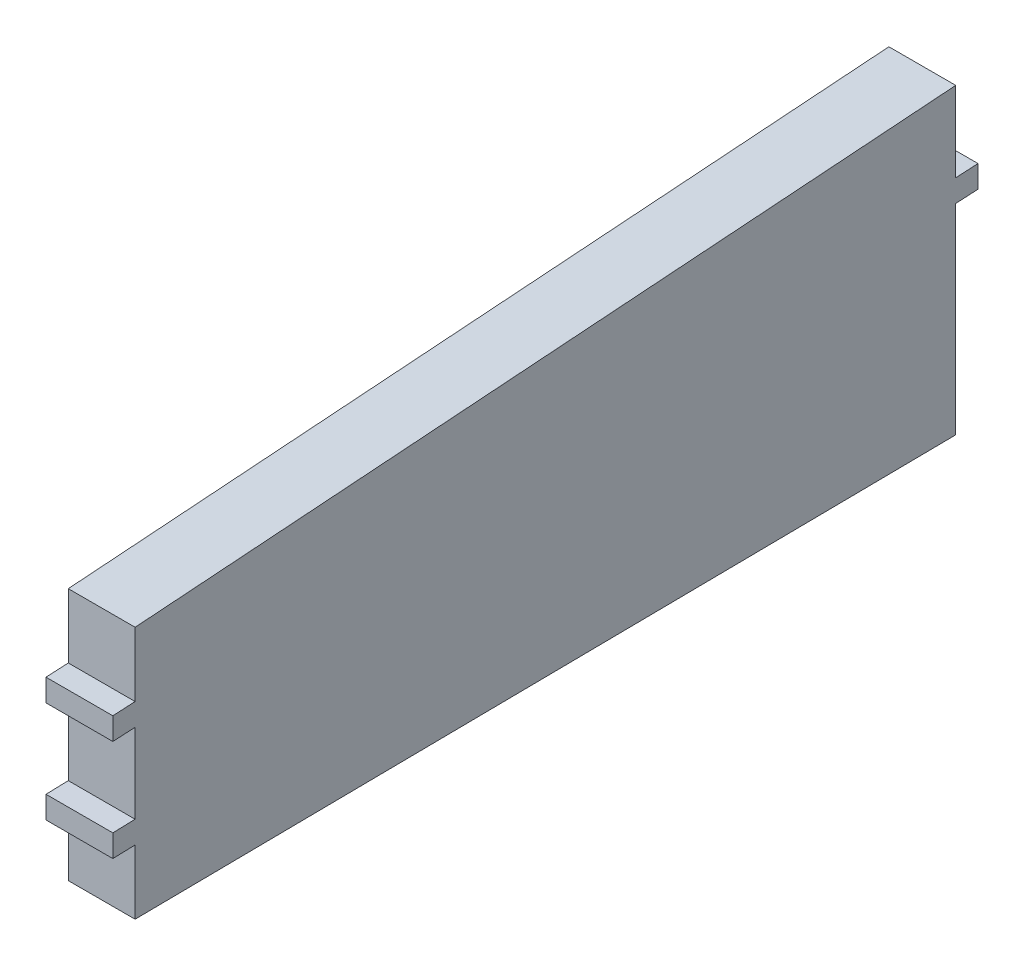
ISO-10303-21;
HEADER;
FILE_DESCRIPTION(('STEP AP214'),'2;1');
FILE_NAME('part.step','',(''),(''),'','','');
FILE_SCHEMA(('AUTOMOTIVE_DESIGN { 1 0 10303 214 1 1 1 1 }'));
ENDSEC;
DATA;
#1=APPLICATION_CONTEXT('core data for automotive mechanical design processes');
#2=APPLICATION_PROTOCOL_DEFINITION('international standard','automotive_design',2000,#1);
#3=PRODUCT_CONTEXT('',#1,'mechanical');
#4=PRODUCT('Part','Part','',(#3));
#5=PRODUCT_RELATED_PRODUCT_CATEGORY('part','',(#4));
#6=PRODUCT_DEFINITION_FORMATION('','',#4);
#7=PRODUCT_DEFINITION_CONTEXT('part definition',#1,'design');
#8=PRODUCT_DEFINITION('design','',#6,#7);
#9=PRODUCT_DEFINITION_SHAPE('','',#8);
#10=(LENGTH_UNIT() NAMED_UNIT(*) SI_UNIT(.MILLI.,.METRE.));
#11=(NAMED_UNIT(*) PLANE_ANGLE_UNIT() SI_UNIT($,.RADIAN.));
#12=(NAMED_UNIT(*) SI_UNIT($,.STERADIAN.) SOLID_ANGLE_UNIT());
#13=UNCERTAINTY_MEASURE_WITH_UNIT(LENGTH_MEASURE(1.E-05),#10,'distance_accuracy_value','');
#14=(GEOMETRIC_REPRESENTATION_CONTEXT(3) GLOBAL_UNCERTAINTY_ASSIGNED_CONTEXT((#13)) GLOBAL_UNIT_ASSIGNED_CONTEXT((#10,
#11,#12)) REPRESENTATION_CONTEXT('',''));
#15=CARTESIAN_POINT('',(0.,0.,0.));
#16=DIRECTION('',(0.,0.,1.));
#17=DIRECTION('',(1.,0.,0.));
#18=AXIS2_PLACEMENT_3D('',#15,#16,#17);
#19=CARTESIAN_POINT('',(243.017706630704,0.,0.));
#20=DIRECTION('',(1.,0.,0.));
#21=DIRECTION('',(0.,0.,-1.));
#22=AXIS2_PLACEMENT_3D('',#19,#20,#21);
#23=PLANE('',#22);
#24=DIRECTION('',(0.,-0.0302886855911997,0.999541192510423));
#25=VECTOR('',#24,1.);
#26=CARTESIAN_POINT('',(243.017706630704,370.209803979882,1137.24369407791));
#27=LINE('',#26,#25);
#28=CARTESIAN_POINT('',(243.017706630704,370.209803979882,1137.24369407791));
#29=VERTEX_POINT('',#28);
#30=CARTESIAN_POINT('',(243.017706630704,370.113593260932,1140.41869407791));
#31=VERTEX_POINT('',#30);
#32=EDGE_CURVE('E157',#29,#31,#27,.T.);
#33=ORIENTED_EDGE('',*,*,#32,.F.);
#34=DIRECTION('',(0.,-1.,0.));
#35=VECTOR('',#34,1.);
#36=CARTESIAN_POINT('',(243.017706630704,381.55777098048,1137.24369407791));
#37=LINE('',#36,#35);
#38=CARTESIAN_POINT('',(243.017706630704,381.55777098048,1137.24369407791));
#39=VERTEX_POINT('',#38);
#40=EDGE_CURVE('E205',#39,#29,#37,.T.);
#41=ORIENTED_EDGE('',*,*,#40,.F.);
#42=DIRECTION('',(0.,0.0527109798388475,-0.99860980998808));
#43=VECTOR('',#42,1.);
#44=CARTESIAN_POINT('',(243.017706630704,381.55777098048,1137.24369407791));
#45=LINE('',#44,#43);
#46=CARTESIAN_POINT('',(243.017706630704,381.39018063707,1140.41869407791));
#47=VERTEX_POINT('',#46);
#48=EDGE_CURVE('E202',#47,#39,#45,.T.);
#49=ORIENTED_EDGE('',*,*,#48,.F.);
#50=DIRECTION('',(0.,-1.,0.));
#51=VECTOR('',#50,1.);
#52=CARTESIAN_POINT('',(243.017706630704,384.56518063707,1140.41869407791));
#53=LINE('',#52,#51);
#54=CARTESIAN_POINT('',(243.017706630704,384.56518063707,1140.41869407791));
#55=VERTEX_POINT('',#54);
#56=EDGE_CURVE('E199',#55,#47,#53,.T.);
#57=ORIENTED_EDGE('',*,*,#56,.F.);
#58=DIRECTION('',(0.,-0.0527109798388301,0.998609809988081));
#59=VECTOR('',#58,1.);
#60=CARTESIAN_POINT('',(243.017706630704,384.73277098048,1137.24369407791));
#61=LINE('',#60,#59);
#62=CARTESIAN_POINT('',(243.017706630704,384.73277098048,1137.24369407791));
#63=VERTEX_POINT('',#62);
#64=EDGE_CURVE('E196',#63,#55,#61,.T.);
#65=ORIENTED_EDGE('',*,*,#64,.F.);
#66=DIRECTION('',(0.,-1.,0.));
#67=VECTOR('',#66,1.);
#68=CARTESIAN_POINT('',(243.017706630704,393.902469497725,1137.24369407791));
#69=LINE('',#68,#67);
#70=CARTESIAN_POINT('',(243.017706630704,393.902469497725,1137.24369407791));
#71=VERTEX_POINT('',#70);
#72=EDGE_CURVE('E193',#71,#63,#69,.T.);
#73=ORIENTED_EDGE('',*,*,#72,.F.);
#74=DIRECTION('',(0.,-0.0717092650487329,0.997425576825745));
#75=VECTOR('',#74,1.);
#76=CARTESIAN_POINT('',(243.017706630704,402.310214355847,1020.29786065991));
#77=LINE('',#76,#75);
#78=CARTESIAN_POINT('',(243.017706630704,402.310214355847,1020.29786065991));
#79=VERTEX_POINT('',#78);
#80=EDGE_CURVE('E190',#79,#71,#77,.T.);
#81=ORIENTED_EDGE('',*,*,#80,.F.);
#82=DIRECTION('',(0.,1.,0.));
#83=VECTOR('',#82,1.);
#84=CARTESIAN_POINT('',(243.017706630704,390.905681963169,1020.29786065991));
#85=LINE('',#84,#83);
#86=CARTESIAN_POINT('',(243.017706630704,390.905681963169,1020.29786065991));
#87=VERTEX_POINT('',#86);
#88=EDGE_CURVE('E187',#87,#79,#85,.T.);
#89=ORIENTED_EDGE('',*,*,#88,.F.);
#90=DIRECTION('',(0.,-0.0527109798388512,0.998609809988079));
#91=VECTOR('',#90,1.);
#92=CARTESIAN_POINT('',(243.017706630704,391.073272306579,1017.12286065991));
#93=LINE('',#92,#91);
#94=CARTESIAN_POINT('',(243.017706630704,391.073272306579,1017.12286065991));
#95=VERTEX_POINT('',#94);
#96=EDGE_CURVE('E184',#95,#87,#93,.T.);
#97=ORIENTED_EDGE('',*,*,#96,.F.);
#98=DIRECTION('',(0.,1.,0.));
#99=VECTOR('',#98,1.);
#100=CARTESIAN_POINT('',(243.017706630704,387.898272306579,1017.12286065991));
#101=LINE('',#100,#99);
#102=CARTESIAN_POINT('',(243.017706630704,387.898272306579,1017.12286065991));
#103=VERTEX_POINT('',#102);
#104=EDGE_CURVE('E181',#103,#95,#101,.T.);
#105=ORIENTED_EDGE('',*,*,#104,.F.);
#106=DIRECTION('',(0.,0.0527109798388512,-0.998609809988079));
#107=VECTOR('',#106,1.);
#108=CARTESIAN_POINT('',(243.017706630704,387.730681963169,1020.29786065991));
#109=LINE('',#108,#107);
#110=CARTESIAN_POINT('',(243.017706630704,387.730681963169,1020.29786065991));
#111=VERTEX_POINT('',#110);
#112=EDGE_CURVE('E178',#111,#103,#109,.T.);
#113=ORIENTED_EDGE('',*,*,#112,.F.);
#114=DIRECTION('',(0.,1.,0.));
#115=VECTOR('',#114,1.);
#116=CARTESIAN_POINT('',(243.017706630704,359.174033068783,1020.29786065991));
#117=LINE('',#116,#115);
#118=CARTESIAN_POINT('',(243.017706630704,359.174033068783,1020.29786065991));
#119=VERTEX_POINT('',#118);
#120=EDGE_CURVE('E175',#119,#111,#117,.T.);
#121=ORIENTED_EDGE('',*,*,#120,.F.);
#122=DIRECTION('',(0.,0.0111918961808612,-0.999937368768603));
#123=VECTOR('',#122,1.);
#124=CARTESIAN_POINT('',(243.017706630704,357.865105462637,1137.24369407791));
#125=LINE('',#124,#123);
#126=CARTESIAN_POINT('',(243.017706630704,357.865105462637,1137.24369407791));
#127=VERTEX_POINT('',#126);
#128=EDGE_CURVE('E172',#127,#119,#125,.T.);
#129=ORIENTED_EDGE('',*,*,#128,.F.);
#130=DIRECTION('',(0.,-1.,0.));
#131=VECTOR('',#130,1.);
#132=CARTESIAN_POINT('',(243.017706630704,367.034803979882,1137.24369407791));
#133=LINE('',#132,#131);
#134=CARTESIAN_POINT('',(243.017706630704,367.034803979882,1137.24369407791));
#135=VERTEX_POINT('',#134);
#136=EDGE_CURVE('E169',#135,#127,#133,.T.);
#137=ORIENTED_EDGE('',*,*,#136,.F.);
#138=DIRECTION('',(0.,0.0302886855911822,-0.999541192510423));
#139=VECTOR('',#138,1.);
#140=CARTESIAN_POINT('',(243.017706630704,366.938593260932,1140.41869407791));
#141=LINE('',#140,#139);
#142=CARTESIAN_POINT('',(243.017706630704,366.938593260932,1140.41869407791));
#143=VERTEX_POINT('',#142);
#144=EDGE_CURVE('E160',#143,#135,#141,.T.);
#145=ORIENTED_EDGE('',*,*,#144,.F.);
#146=DIRECTION('',(0.,-1.,0.));
#147=VECTOR('',#146,1.);
#148=CARTESIAN_POINT('',(243.017706630704,370.113593260932,1140.41869407791));
#149=LINE('',#148,#147);
#150=EDGE_CURVE('E149',#31,#143,#149,.T.);
#151=ORIENTED_EDGE('',*,*,#150,.F.);
#152=EDGE_LOOP('',(#33,#41,#49,#57,#65,#73,#81,#89,#97,#105,#113,#121,#129,#137,#145,#151));
#153=FACE_BOUND('',#152,.T.);
#154=ADVANCED_FACE('F33',(#153),#23,.F.);
#155=CARTESIAN_POINT('',(383.604639482193,381.55777098048,1137.24369407791));
#156=DIRECTION('',(0.,0.,-1.));
#157=DIRECTION('',(-1.,0.,0.));
#158=AXIS2_PLACEMENT_3D('',#155,#156,#157);
#159=PLANE('',#158);
#160=DIRECTION('',(-1.,0.,0.));
#161=VECTOR('',#160,1.);
#162=CARTESIAN_POINT('',(383.604639482193,370.209803979882,1137.24369407791));
#163=LINE('',#162,#161);
#164=CARTESIAN_POINT('',(252.542706630704,370.209803979882,1137.24369407791));
#165=VERTEX_POINT('',#164);
#166=EDGE_CURVE('E163',#165,#29,#163,.T.);
#167=ORIENTED_EDGE('',*,*,#166,.F.);
#168=DIRECTION('',(0.,1.,0.));
#169=VECTOR('',#168,1.);
#170=CARTESIAN_POINT('',(252.542706630704,381.55777098048,1137.24369407791));
#171=LINE('',#170,#169);
#172=CARTESIAN_POINT('',(252.542706630704,381.55777098048,1137.24369407791));
#173=VERTEX_POINT('',#172);
#174=EDGE_CURVE('E37',#165,#173,#171,.T.);
#175=ORIENTED_EDGE('',*,*,#174,.T.);
#176=DIRECTION('',(-1.,0.,0.));
#177=VECTOR('',#176,1.);
#178=CARTESIAN_POINT('',(383.604639482193,381.55777098048,1137.24369407791));
#179=LINE('',#178,#177);
#180=EDGE_CURVE('E208',#173,#39,#179,.T.);
#181=ORIENTED_EDGE('',*,*,#180,.T.);
#182=ORIENTED_EDGE('',*,*,#40,.T.);
#183=EDGE_LOOP('',(#167,#175,#181,#182));
#184=FACE_BOUND('',#183,.T.);
#185=ADVANCED_FACE('F277',(#184),#159,.F.);
#186=CARTESIAN_POINT('',(383.604639482193,381.55777098048,1137.24369407791));
#187=DIRECTION('',(0.,0.99860980998808,0.0527109798388475));
#188=DIRECTION('',(0.,-0.0527109798388475,0.99860980998808));
#189=AXIS2_PLACEMENT_3D('',#186,#187,#188);
#190=PLANE('',#189);
#191=ORIENTED_EDGE('',*,*,#180,.F.);
#192=DIRECTION('',(0.,-0.0527109798388475,0.99860980998808));
#193=VECTOR('',#192,1.);
#194=CARTESIAN_POINT('',(252.542706630704,381.55777098048,1137.24369407791));
#195=LINE('',#194,#193);
#196=CARTESIAN_POINT('',(252.542706630704,381.39018063707,1140.41869407791));
#197=VERTEX_POINT('',#196);
#198=EDGE_CURVE('E271',#173,#197,#195,.T.);
#199=ORIENTED_EDGE('',*,*,#198,.T.);
#200=DIRECTION('',(-1.,0.,0.));
#201=VECTOR('',#200,1.);
#202=CARTESIAN_POINT('',(383.604639482193,381.39018063707,1140.41869407791));
#203=LINE('',#202,#201);
#204=EDGE_CURVE('E210',#197,#47,#203,.T.);
#205=ORIENTED_EDGE('',*,*,#204,.T.);
#206=ORIENTED_EDGE('',*,*,#48,.T.);
#207=EDGE_LOOP('',(#191,#199,#205,#206));
#208=FACE_BOUND('',#207,.T.);
#209=ADVANCED_FACE('F280',(#208),#190,.F.);
#210=CARTESIAN_POINT('',(383.604639482193,384.56518063707,1140.41869407791));
#211=DIRECTION('',(0.,0.,-1.));
#212=DIRECTION('',(-1.,0.,0.));
#213=AXIS2_PLACEMENT_3D('',#210,#211,#212);
#214=PLANE('',#213);
#215=ORIENTED_EDGE('',*,*,#204,.F.);
#216=DIRECTION('',(0.,1.,0.));
#217=VECTOR('',#216,1.);
#218=CARTESIAN_POINT('',(252.542706630704,384.56518063707,1140.41869407791));
#219=LINE('',#218,#217);
#220=CARTESIAN_POINT('',(252.542706630704,384.56518063707,1140.41869407791));
#221=VERTEX_POINT('',#220);
#222=EDGE_CURVE('E268',#197,#221,#219,.T.);
#223=ORIENTED_EDGE('',*,*,#222,.T.);
#224=DIRECTION('',(-1.,0.,0.));
#225=VECTOR('',#224,1.);
#226=CARTESIAN_POINT('',(383.604639482193,384.56518063707,1140.41869407791));
#227=LINE('',#226,#225);
#228=EDGE_CURVE('E212',#221,#55,#227,.T.);
#229=ORIENTED_EDGE('',*,*,#228,.T.);
#230=ORIENTED_EDGE('',*,*,#56,.T.);
#231=EDGE_LOOP('',(#215,#223,#229,#230));
#232=FACE_BOUND('',#231,.T.);
#233=ADVANCED_FACE('F286',(#232),#214,.F.);
#234=CARTESIAN_POINT('',(383.604639482193,384.73277098048,1137.24369407791));
#235=DIRECTION('',(0.,-0.998609809988081,-0.0527109798388301));
#236=DIRECTION('',(0.,0.0527109798388301,-0.998609809988081));
#237=AXIS2_PLACEMENT_3D('',#234,#235,#236);
#238=PLANE('',#237);
#239=ORIENTED_EDGE('',*,*,#228,.F.);
#240=DIRECTION('',(0.,0.0527109798388301,-0.998609809988081));
#241=VECTOR('',#240,1.);
#242=CARTESIAN_POINT('',(252.542706630704,384.73277098048,1137.24369407791));
#243=LINE('',#242,#241);
#244=CARTESIAN_POINT('',(252.542706630704,384.73277098048,1137.24369407791));
#245=VERTEX_POINT('',#244);
#246=EDGE_CURVE('E265',#221,#245,#243,.T.);
#247=ORIENTED_EDGE('',*,*,#246,.T.);
#248=DIRECTION('',(-1.,0.,0.));
#249=VECTOR('',#248,1.);
#250=CARTESIAN_POINT('',(383.604639482193,384.73277098048,1137.24369407791));
#251=LINE('',#250,#249);
#252=EDGE_CURVE('E214',#245,#63,#251,.T.);
#253=ORIENTED_EDGE('',*,*,#252,.T.);
#254=ORIENTED_EDGE('',*,*,#64,.T.);
#255=EDGE_LOOP('',(#239,#247,#253,#254));
#256=FACE_BOUND('',#255,.T.);
#257=ADVANCED_FACE('F289',(#256),#238,.F.);
#258=CARTESIAN_POINT('',(383.604639482193,393.902469497725,1137.24369407791));
#259=DIRECTION('',(0.,0.,-1.));
#260=DIRECTION('',(-1.,0.,0.));
#261=AXIS2_PLACEMENT_3D('',#258,#259,#260);
#262=PLANE('',#261);
#263=ORIENTED_EDGE('',*,*,#252,.F.);
#264=DIRECTION('',(0.,1.,0.));
#265=VECTOR('',#264,1.);
#266=CARTESIAN_POINT('',(252.542706630704,393.902469497725,1137.24369407791));
#267=LINE('',#266,#265);
#268=CARTESIAN_POINT('',(252.542706630704,393.902469497725,1137.24369407791));
#269=VERTEX_POINT('',#268);
#270=EDGE_CURVE('E262',#245,#269,#267,.T.);
#271=ORIENTED_EDGE('',*,*,#270,.T.);
#272=DIRECTION('',(-1.,0.,0.));
#273=VECTOR('',#272,1.);
#274=CARTESIAN_POINT('',(383.604639482193,393.902469497725,1137.24369407791));
#275=LINE('',#274,#273);
#276=EDGE_CURVE('E216',#269,#71,#275,.T.);
#277=ORIENTED_EDGE('',*,*,#276,.T.);
#278=ORIENTED_EDGE('',*,*,#72,.T.);
#279=EDGE_LOOP('',(#263,#271,#277,#278));
#280=FACE_BOUND('',#279,.T.);
#281=ADVANCED_FACE('F292',(#280),#262,.F.);
#282=CARTESIAN_POINT('',(383.604639482193,402.310214355847,1020.29786065991));
#283=DIRECTION('',(0.,-0.997425576825745,-0.0717092650487329));
#284=DIRECTION('',(0.,0.0717092650487329,-0.997425576825745));
#285=AXIS2_PLACEMENT_3D('',#282,#283,#284);
#286=PLANE('',#285);
#287=ORIENTED_EDGE('',*,*,#276,.F.);
#288=DIRECTION('',(0.,0.0717092650487329,-0.997425576825745));
#289=VECTOR('',#288,1.);
#290=CARTESIAN_POINT('',(252.542706630704,402.310214355847,1020.29786065991));
#291=LINE('',#290,#289);
#292=CARTESIAN_POINT('',(252.542706630704,402.310214355847,1020.29786065991));
#293=VERTEX_POINT('',#292);
#294=EDGE_CURVE('E259',#269,#293,#291,.T.);
#295=ORIENTED_EDGE('',*,*,#294,.T.);
#296=DIRECTION('',(-1.,0.,0.));
#297=VECTOR('',#296,1.);
#298=CARTESIAN_POINT('',(383.604639482193,402.310214355847,1020.29786065991));
#299=LINE('',#298,#297);
#300=EDGE_CURVE('E218',#293,#79,#299,.T.);
#301=ORIENTED_EDGE('',*,*,#300,.T.);
#302=ORIENTED_EDGE('',*,*,#80,.T.);
#303=EDGE_LOOP('',(#287,#295,#301,#302));
#304=FACE_BOUND('',#303,.T.);
#305=ADVANCED_FACE('F298',(#304),#286,.F.);
#306=CARTESIAN_POINT('',(383.604639482193,390.905681963169,1020.29786065991));
#307=DIRECTION('',(0.,0.,1.));
#308=DIRECTION('',(1.,0.,0.));
#309=AXIS2_PLACEMENT_3D('',#306,#307,#308);
#310=PLANE('',#309);
#311=ORIENTED_EDGE('',*,*,#300,.F.);
#312=DIRECTION('',(0.,-1.,0.));
#313=VECTOR('',#312,1.);
#314=CARTESIAN_POINT('',(252.542706630704,390.905681963169,1020.29786065991));
#315=LINE('',#314,#313);
#316=CARTESIAN_POINT('',(252.542706630704,390.905681963169,1020.29786065991));
#317=VERTEX_POINT('',#316);
#318=EDGE_CURVE('E256',#293,#317,#315,.T.);
#319=ORIENTED_EDGE('',*,*,#318,.T.);
#320=DIRECTION('',(-1.,0.,0.));
#321=VECTOR('',#320,1.);
#322=CARTESIAN_POINT('',(383.604639482193,390.905681963169,1020.29786065991));
#323=LINE('',#322,#321);
#324=EDGE_CURVE('E220',#317,#87,#323,.T.);
#325=ORIENTED_EDGE('',*,*,#324,.T.);
#326=ORIENTED_EDGE('',*,*,#88,.T.);
#327=EDGE_LOOP('',(#311,#319,#325,#326));
#328=FACE_BOUND('',#327,.T.);
#329=ADVANCED_FACE('F301',(#328),#310,.F.);
#330=CARTESIAN_POINT('',(383.604639482193,391.073272306579,1017.12286065991));
#331=DIRECTION('',(0.,-0.998609809988079,-0.0527109798388512));
#332=DIRECTION('',(0.,0.0527109798388512,-0.99860980998808));
#333=AXIS2_PLACEMENT_3D('',#330,#331,#332);
#334=PLANE('',#333);
#335=ORIENTED_EDGE('',*,*,#324,.F.);
#336=DIRECTION('',(0.,0.0527109798388512,-0.99860980998808));
#337=VECTOR('',#336,1.);
#338=CARTESIAN_POINT('',(252.542706630704,391.073272306579,1017.12286065991));
#339=LINE('',#338,#337);
#340=CARTESIAN_POINT('',(252.542706630704,391.073272306579,1017.12286065991));
#341=VERTEX_POINT('',#340);
#342=EDGE_CURVE('E253',#317,#341,#339,.T.);
#343=ORIENTED_EDGE('',*,*,#342,.T.);
#344=DIRECTION('',(-1.,0.,0.));
#345=VECTOR('',#344,1.);
#346=CARTESIAN_POINT('',(383.604639482193,391.073272306579,1017.12286065991));
#347=LINE('',#346,#345);
#348=EDGE_CURVE('E222',#341,#95,#347,.T.);
#349=ORIENTED_EDGE('',*,*,#348,.T.);
#350=ORIENTED_EDGE('',*,*,#96,.T.);
#351=EDGE_LOOP('',(#335,#343,#349,#350));
#352=FACE_BOUND('',#351,.T.);
#353=ADVANCED_FACE('F304',(#352),#334,.F.);
#354=CARTESIAN_POINT('',(383.604639482193,387.898272306579,1017.12286065991));
#355=DIRECTION('',(0.,0.,1.));
#356=DIRECTION('',(1.,0.,0.));
#357=AXIS2_PLACEMENT_3D('',#354,#355,#356);
#358=PLANE('',#357);
#359=ORIENTED_EDGE('',*,*,#348,.F.);
#360=DIRECTION('',(0.,-1.,0.));
#361=VECTOR('',#360,1.);
#362=CARTESIAN_POINT('',(252.542706630704,387.898272306579,1017.12286065991));
#363=LINE('',#362,#361);
#364=CARTESIAN_POINT('',(252.542706630704,387.898272306579,1017.12286065991));
#365=VERTEX_POINT('',#364);
#366=EDGE_CURVE('E250',#341,#365,#363,.T.);
#367=ORIENTED_EDGE('',*,*,#366,.T.);
#368=DIRECTION('',(-1.,0.,0.));
#369=VECTOR('',#368,1.);
#370=CARTESIAN_POINT('',(383.604639482193,387.898272306579,1017.12286065991));
#371=LINE('',#370,#369);
#372=EDGE_CURVE('E224',#365,#103,#371,.T.);
#373=ORIENTED_EDGE('',*,*,#372,.T.);
#374=ORIENTED_EDGE('',*,*,#104,.T.);
#375=EDGE_LOOP('',(#359,#367,#373,#374));
#376=FACE_BOUND('',#375,.T.);
#377=ADVANCED_FACE('F310',(#376),#358,.F.);
#378=CARTESIAN_POINT('',(383.604639482193,387.730681963169,1020.29786065991));
#379=DIRECTION('',(0.,0.998609809988079,0.0527109798388512));
#380=DIRECTION('',(0.,-0.0527109798388512,0.99860980998808));
#381=AXIS2_PLACEMENT_3D('',#378,#379,#380);
#382=PLANE('',#381);
#383=ORIENTED_EDGE('',*,*,#372,.F.);
#384=DIRECTION('',(0.,-0.0527109798388512,0.99860980998808));
#385=VECTOR('',#384,1.);
#386=CARTESIAN_POINT('',(252.542706630704,387.730681963169,1020.29786065991));
#387=LINE('',#386,#385);
#388=CARTESIAN_POINT('',(252.542706630704,387.730681963169,1020.29786065991));
#389=VERTEX_POINT('',#388);
#390=EDGE_CURVE('E247',#365,#389,#387,.T.);
#391=ORIENTED_EDGE('',*,*,#390,.T.);
#392=DIRECTION('',(-1.,0.,0.));
#393=VECTOR('',#392,1.);
#394=CARTESIAN_POINT('',(383.604639482193,387.730681963169,1020.29786065991));
#395=LINE('',#394,#393);
#396=EDGE_CURVE('E226',#389,#111,#395,.T.);
#397=ORIENTED_EDGE('',*,*,#396,.T.);
#398=ORIENTED_EDGE('',*,*,#112,.T.);
#399=EDGE_LOOP('',(#383,#391,#397,#398));
#400=FACE_BOUND('',#399,.T.);
#401=ADVANCED_FACE('F313',(#400),#382,.F.);
#402=CARTESIAN_POINT('',(383.604639482193,359.174033068783,1020.29786065991));
#403=DIRECTION('',(0.,0.,1.));
#404=DIRECTION('',(1.,0.,0.));
#405=AXIS2_PLACEMENT_3D('',#402,#403,#404);
#406=PLANE('',#405);
#407=ORIENTED_EDGE('',*,*,#396,.F.);
#408=DIRECTION('',(0.,-1.,0.));
#409=VECTOR('',#408,1.);
#410=CARTESIAN_POINT('',(252.542706630704,359.174033068783,1020.29786065991));
#411=LINE('',#410,#409);
#412=CARTESIAN_POINT('',(252.542706630704,359.174033068783,1020.29786065991));
#413=VERTEX_POINT('',#412);
#414=EDGE_CURVE('E244',#389,#413,#411,.T.);
#415=ORIENTED_EDGE('',*,*,#414,.T.);
#416=DIRECTION('',(-1.,0.,0.));
#417=VECTOR('',#416,1.);
#418=CARTESIAN_POINT('',(383.604639482193,359.174033068783,1020.29786065991));
#419=LINE('',#418,#417);
#420=EDGE_CURVE('E228',#413,#119,#419,.T.);
#421=ORIENTED_EDGE('',*,*,#420,.T.);
#422=ORIENTED_EDGE('',*,*,#120,.T.);
#423=EDGE_LOOP('',(#407,#415,#421,#422));
#424=FACE_BOUND('',#423,.T.);
#425=ADVANCED_FACE('F316',(#424),#406,.F.);
#426=CARTESIAN_POINT('',(383.604639482193,357.865105462637,1137.24369407791));
#427=DIRECTION('',(0.,0.999937368768603,0.0111918961808612));
#428=DIRECTION('',(0.,-0.0111918961808612,0.999937368768603));
#429=AXIS2_PLACEMENT_3D('',#426,#427,#428);
#430=PLANE('',#429);
#431=ORIENTED_EDGE('',*,*,#420,.F.);
#432=DIRECTION('',(0.,-0.0111918961808612,0.999937368768603));
#433=VECTOR('',#432,1.);
#434=CARTESIAN_POINT('',(252.542706630704,357.865105462637,1137.24369407791));
#435=LINE('',#434,#433);
#436=CARTESIAN_POINT('',(252.542706630704,357.865105462637,1137.24369407791));
#437=VERTEX_POINT('',#436);
#438=EDGE_CURVE('E239',#413,#437,#435,.T.);
#439=ORIENTED_EDGE('',*,*,#438,.T.);
#440=DIRECTION('',(-1.,0.,0.));
#441=VECTOR('',#440,1.);
#442=CARTESIAN_POINT('',(383.604639482193,357.865105462637,1137.24369407791));
#443=LINE('',#442,#441);
#444=EDGE_CURVE('E230',#437,#127,#443,.T.);
#445=ORIENTED_EDGE('',*,*,#444,.T.);
#446=ORIENTED_EDGE('',*,*,#128,.T.);
#447=EDGE_LOOP('',(#431,#439,#445,#446));
#448=FACE_BOUND('',#447,.T.);
#449=ADVANCED_FACE('F320',(#448),#430,.F.);
#450=CARTESIAN_POINT('',(383.604639482193,367.034803979882,1137.24369407791));
#451=DIRECTION('',(0.,0.,-1.));
#452=DIRECTION('',(-1.,0.,0.));
#453=AXIS2_PLACEMENT_3D('',#450,#451,#452);
#454=PLANE('',#453);
#455=ORIENTED_EDGE('',*,*,#444,.F.);
#456=DIRECTION('',(0.,1.,0.));
#457=VECTOR('',#456,1.);
#458=CARTESIAN_POINT('',(252.542706630704,367.034803979882,1137.24369407791));
#459=LINE('',#458,#457);
#460=CARTESIAN_POINT('',(252.542706630704,367.034803979882,1137.24369407791));
#461=VERTEX_POINT('',#460);
#462=EDGE_CURVE('E237',#437,#461,#459,.T.);
#463=ORIENTED_EDGE('',*,*,#462,.T.);
#464=DIRECTION('',(-1.,0.,0.));
#465=VECTOR('',#464,1.);
#466=CARTESIAN_POINT('',(383.604639482193,367.034803979882,1137.24369407791));
#467=LINE('',#466,#465);
#468=EDGE_CURVE('E232',#461,#135,#467,.T.);
#469=ORIENTED_EDGE('',*,*,#468,.T.);
#470=ORIENTED_EDGE('',*,*,#136,.T.);
#471=EDGE_LOOP('',(#455,#463,#469,#470));
#472=FACE_BOUND('',#471,.T.);
#473=ADVANCED_FACE('F323',(#472),#454,.F.);
#474=CARTESIAN_POINT('',(383.604639482193,366.938593260932,1140.41869407791));
#475=DIRECTION('',(0.,0.999541192510423,0.0302886855911822));
#476=DIRECTION('',(0.,-0.0302886855911822,0.999541192510423));
#477=AXIS2_PLACEMENT_3D('',#474,#475,#476);
#478=PLANE('',#477);
#479=ORIENTED_EDGE('',*,*,#468,.F.);
#480=DIRECTION('',(0.,-0.0302886855911822,0.999541192510423));
#481=VECTOR('',#480,1.);
#482=CARTESIAN_POINT('',(252.542706630704,366.938593260932,1140.41869407791));
#483=LINE('',#482,#481);
#484=CARTESIAN_POINT('',(252.542706630704,366.938593260932,1140.41869407791));
#485=VERTEX_POINT('',#484);
#486=EDGE_CURVE('E54',#461,#485,#483,.T.);
#487=ORIENTED_EDGE('',*,*,#486,.T.);
#488=DIRECTION('',(-1.,0.,0.));
#489=VECTOR('',#488,1.);
#490=CARTESIAN_POINT('',(383.604639482193,366.938593260932,1140.41869407791));
#491=LINE('',#490,#489);
#492=EDGE_CURVE('E153',#485,#143,#491,.T.);
#493=ORIENTED_EDGE('',*,*,#492,.T.);
#494=ORIENTED_EDGE('',*,*,#144,.T.);
#495=EDGE_LOOP('',(#479,#487,#493,#494));
#496=FACE_BOUND('',#495,.T.);
#497=ADVANCED_FACE('F235',(#496),#478,.F.);
#498=CARTESIAN_POINT('',(383.604639482193,370.113593260932,1140.41869407791));
#499=DIRECTION('',(0.,0.,-1.));
#500=DIRECTION('',(-1.,0.,0.));
#501=AXIS2_PLACEMENT_3D('',#498,#499,#500);
#502=PLANE('',#501);
#503=ORIENTED_EDGE('',*,*,#492,.F.);
#504=DIRECTION('',(0.,1.,0.));
#505=VECTOR('',#504,1.);
#506=CARTESIAN_POINT('',(252.542706630704,370.113593260932,1140.41869407791));
#507=LINE('',#506,#505);
#508=CARTESIAN_POINT('',(252.542706630704,370.113593260932,1140.41869407791));
#509=VERTEX_POINT('',#508);
#510=EDGE_CURVE('E42',#485,#509,#507,.T.);
#511=ORIENTED_EDGE('',*,*,#510,.T.);
#512=DIRECTION('',(-1.,0.,0.));
#513=VECTOR('',#512,1.);
#514=CARTESIAN_POINT('',(383.604639482193,370.113593260932,1140.41869407791));
#515=LINE('',#514,#513);
#516=EDGE_CURVE('E146',#509,#31,#515,.T.);
#517=ORIENTED_EDGE('',*,*,#516,.T.);
#518=ORIENTED_EDGE('',*,*,#150,.T.);
#519=EDGE_LOOP('',(#503,#511,#517,#518));
#520=FACE_BOUND('',#519,.T.);
#521=ADVANCED_FACE('F148',(#520),#502,.F.);
#522=CARTESIAN_POINT('',(383.604639482193,370.209803979882,1137.24369407791));
#523=DIRECTION('',(0.,-0.999541192510422,-0.0302886855911997));
#524=DIRECTION('',(0.,0.0302886855911997,-0.999541192510423));
#525=AXIS2_PLACEMENT_3D('',#522,#523,#524);
#526=PLANE('',#525);
#527=ORIENTED_EDGE('',*,*,#516,.F.);
#528=DIRECTION('',(0.,0.0302886855911997,-0.999541192510423));
#529=VECTOR('',#528,1.);
#530=CARTESIAN_POINT('',(252.542706630704,370.209803979882,1137.24369407791));
#531=LINE('',#530,#529);
#532=EDGE_CURVE('E11',#509,#165,#531,.T.);
#533=ORIENTED_EDGE('',*,*,#532,.T.);
#534=ORIENTED_EDGE('',*,*,#166,.T.);
#535=ORIENTED_EDGE('',*,*,#32,.T.);
#536=EDGE_LOOP('',(#527,#533,#534,#535));
#537=FACE_BOUND('',#536,.T.);
#538=ADVANCED_FACE('F35',(#537),#526,.F.);
#539=CARTESIAN_POINT('',(252.542706630704,344.83433889611,776.881194001698));
#540=DIRECTION('',(-1.,0.,0.));
#541=DIRECTION('',(0.,0.,1.));
#542=AXIS2_PLACEMENT_3D('',#539,#540,#541);
#543=PLANE('',#542);
#544=ORIENTED_EDGE('',*,*,#510,.F.);
#545=ORIENTED_EDGE('',*,*,#486,.F.);
#546=ORIENTED_EDGE('',*,*,#462,.F.);
#547=ORIENTED_EDGE('',*,*,#438,.F.);
#548=ORIENTED_EDGE('',*,*,#414,.F.);
#549=ORIENTED_EDGE('',*,*,#390,.F.);
#550=ORIENTED_EDGE('',*,*,#366,.F.);
#551=ORIENTED_EDGE('',*,*,#342,.F.);
#552=ORIENTED_EDGE('',*,*,#318,.F.);
#553=ORIENTED_EDGE('',*,*,#294,.F.);
#554=ORIENTED_EDGE('',*,*,#270,.F.);
#555=ORIENTED_EDGE('',*,*,#246,.F.);
#556=ORIENTED_EDGE('',*,*,#222,.F.);
#557=ORIENTED_EDGE('',*,*,#198,.F.);
#558=ORIENTED_EDGE('',*,*,#174,.F.);
#559=ORIENTED_EDGE('',*,*,#532,.F.);
#560=EDGE_LOOP('',(#544,#545,#546,#547,#548,#549,#550,#551,#552,#553,#554,#555,#556,#557,#558,#559));
#561=FACE_BOUND('',#560,.T.);
#562=ADVANCED_FACE('F278',(#561),#543,.F.);
#563=CLOSED_SHELL('',(#154,#185,#209,#233,#257,#281,#305,#329,#353,#377,#401,#425,#449,#473,
#497,#521,#538,#562));
#564=MANIFOLD_SOLID_BREP('B2',#563);
#565=ADVANCED_BREP_SHAPE_REPRESENTATION('',(#18,#564),#14);
#566=SHAPE_DEFINITION_REPRESENTATION(#9,#565);
ENDSEC;
END-ISO-10303-21;
